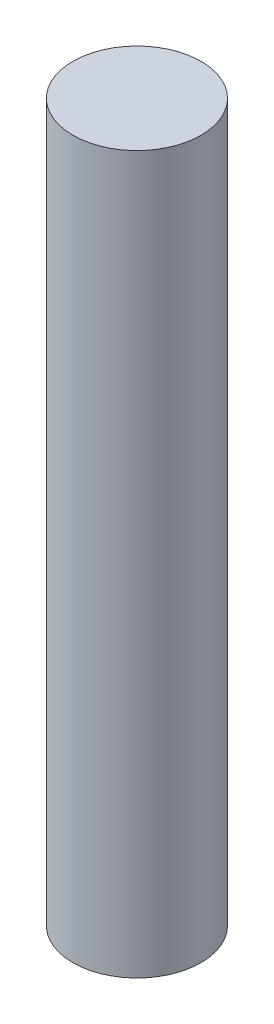
ISO-10303-21;
HEADER;
FILE_DESCRIPTION(('STEP AP214'),'2;1');
FILE_NAME('part.step','',(''),(''),'','','');
FILE_SCHEMA(('AUTOMOTIVE_DESIGN { 1 0 10303 214 1 1 1 1 }'));
ENDSEC;
DATA;
#1=APPLICATION_CONTEXT('core data for automotive mechanical design processes');
#2=APPLICATION_PROTOCOL_DEFINITION('international standard','automotive_design',2000,#1);
#3=PRODUCT_CONTEXT('',#1,'mechanical');
#4=PRODUCT('Part','Part','',(#3));
#5=PRODUCT_RELATED_PRODUCT_CATEGORY('part','',(#4));
#6=PRODUCT_DEFINITION_FORMATION('','',#4);
#7=PRODUCT_DEFINITION_CONTEXT('part definition',#1,'design');
#8=PRODUCT_DEFINITION('design','',#6,#7);
#9=PRODUCT_DEFINITION_SHAPE('','',#8);
#10=(LENGTH_UNIT() NAMED_UNIT(*) SI_UNIT(.MILLI.,.METRE.));
#11=(NAMED_UNIT(*) PLANE_ANGLE_UNIT() SI_UNIT($,.RADIAN.));
#12=(NAMED_UNIT(*) SI_UNIT($,.STERADIAN.) SOLID_ANGLE_UNIT());
#13=UNCERTAINTY_MEASURE_WITH_UNIT(LENGTH_MEASURE(1.E-05),#10,'distance_accuracy_value','');
#14=(GEOMETRIC_REPRESENTATION_CONTEXT(3) GLOBAL_UNCERTAINTY_ASSIGNED_CONTEXT((#13)) GLOBAL_UNIT_ASSIGNED_CONTEXT((#10,
#11,#12)) REPRESENTATION_CONTEXT('',''));
#15=CARTESIAN_POINT('',(0.,0.,0.));
#16=DIRECTION('',(0.,0.,1.));
#17=DIRECTION('',(1.,0.,0.));
#18=AXIS2_PLACEMENT_3D('',#15,#16,#17);
#19=CARTESIAN_POINT('',(0.,642.001876910326,0.));
#20=DIRECTION('',(0.,-1.,0.));
#21=DIRECTION('',(0.,0.,-1.));
#22=AXIS2_PLACEMENT_3D('',#19,#20,#21);
#23=CYLINDRICAL_SURFACE('',#22,29.5);
#24=CARTESIAN_POINT('',(0.,642.001876910326,0.));
#25=DIRECTION('',(0.,1.,0.));
#26=DIRECTION('',(0.,0.,1.));
#27=AXIS2_PLACEMENT_3D('',#24,#25,#26);
#28=CIRCLE('',#27,29.5);
#29=CARTESIAN_POINT('',(0.,642.001876910326,29.5));
#30=VERTEX_POINT('',#29);
#31=EDGE_CURVE('E10',#30,#30,#28,.T.);
#32=ORIENTED_EDGE('',*,*,#31,.F.);
#33=EDGE_LOOP('',(#32));
#34=FACE_BOUND('',#33,.T.);
#35=CARTESIAN_POINT('',(0.,312.001876910326,0.));
#36=DIRECTION('',(0.,1.,0.));
#37=DIRECTION('',(0.,0.,1.));
#38=AXIS2_PLACEMENT_3D('',#35,#36,#37);
#39=CIRCLE('',#38,29.5);
#40=CARTESIAN_POINT('',(0.,312.001876910326,29.5));
#41=VERTEX_POINT('',#40);
#42=EDGE_CURVE('E42',#41,#41,#39,.T.);
#43=ORIENTED_EDGE('',*,*,#42,.T.);
#44=EDGE_LOOP('',(#43));
#45=FACE_BOUND('',#44,.T.);
#46=ADVANCED_FACE('F39',(#34,#45),#23,.T.);
#47=CARTESIAN_POINT('',(0.,642.001876910326,0.));
#48=DIRECTION('',(0.,1.,0.));
#49=DIRECTION('',(0.,0.,1.));
#50=AXIS2_PLACEMENT_3D('',#47,#48,#49);
#51=PLANE('',#50);
#52=ORIENTED_EDGE('',*,*,#31,.T.);
#53=EDGE_LOOP('',(#52));
#54=FACE_BOUND('',#53,.T.);
#55=ADVANCED_FACE('F54',(#54),#51,.T.);
#56=CARTESIAN_POINT('',(0.,312.001876910326,0.));
#57=DIRECTION('',(0.,1.,0.));
#58=DIRECTION('',(0.,0.,1.));
#59=AXIS2_PLACEMENT_3D('',#56,#57,#58);
#60=PLANE('',#59);
#61=ORIENTED_EDGE('',*,*,#42,.F.);
#62=EDGE_LOOP('',(#61));
#63=FACE_BOUND('',#62,.T.);
#64=ADVANCED_FACE('F52',(#63),#60,.F.);
#65=CLOSED_SHELL('',(#46,#55,#64));
#66=MANIFOLD_SOLID_BREP('B2',#65);
#67=ADVANCED_BREP_SHAPE_REPRESENTATION('',(#18,#66),#14);
#68=SHAPE_DEFINITION_REPRESENTATION(#9,#67);
ENDSEC;
END-ISO-10303-21;
